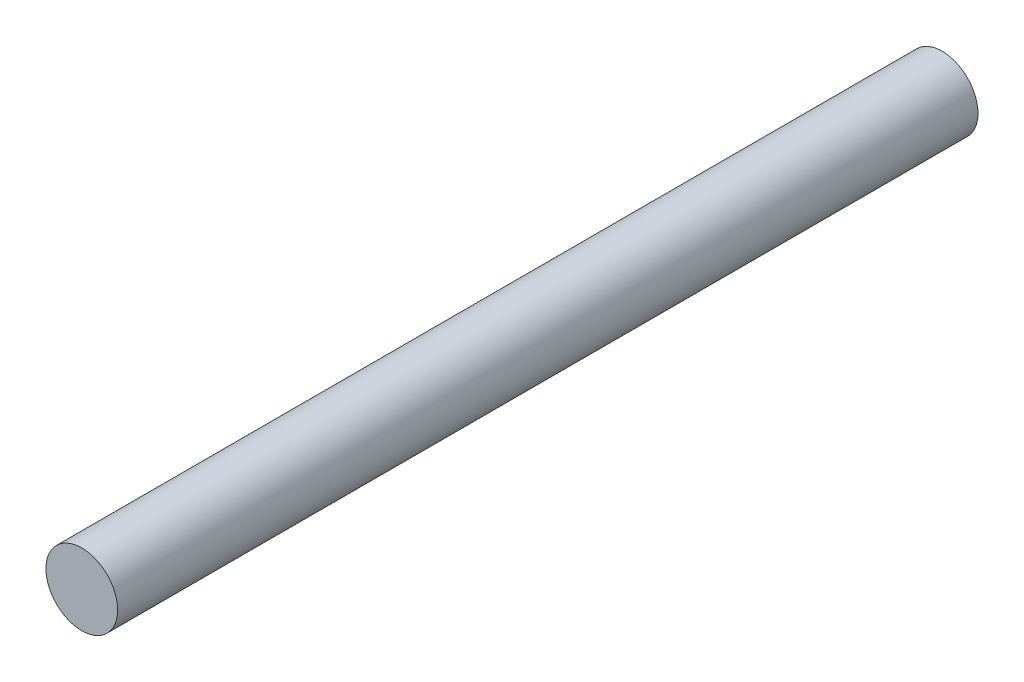
ISO-10303-21;
HEADER;
FILE_DESCRIPTION(('STEP AP214'),'2;1');
FILE_NAME('part.step','',(''),(''),'','','');
FILE_SCHEMA(('AUTOMOTIVE_DESIGN { 1 0 10303 214 1 1 1 1 }'));
ENDSEC;
DATA;
#1=APPLICATION_CONTEXT('core data for automotive mechanical design processes');
#2=APPLICATION_PROTOCOL_DEFINITION('international standard','automotive_design',2000,#1);
#3=PRODUCT_CONTEXT('',#1,'mechanical');
#4=PRODUCT('Part','Part','',(#3));
#5=PRODUCT_RELATED_PRODUCT_CATEGORY('part','',(#4));
#6=PRODUCT_DEFINITION_FORMATION('','',#4);
#7=PRODUCT_DEFINITION_CONTEXT('part definition',#1,'design');
#8=PRODUCT_DEFINITION('design','',#6,#7);
#9=PRODUCT_DEFINITION_SHAPE('','',#8);
#10=(LENGTH_UNIT() NAMED_UNIT(*) SI_UNIT(.MILLI.,.METRE.));
#11=(NAMED_UNIT(*) PLANE_ANGLE_UNIT() SI_UNIT($,.RADIAN.));
#12=(NAMED_UNIT(*) SI_UNIT($,.STERADIAN.) SOLID_ANGLE_UNIT());
#13=UNCERTAINTY_MEASURE_WITH_UNIT(LENGTH_MEASURE(1.E-05),#10,'distance_accuracy_value','');
#14=(GEOMETRIC_REPRESENTATION_CONTEXT(3) GLOBAL_UNCERTAINTY_ASSIGNED_CONTEXT((#13)) GLOBAL_UNIT_ASSIGNED_CONTEXT((#10,
#11,#12)) REPRESENTATION_CONTEXT('',''));
#15=CARTESIAN_POINT('',(0.,0.,0.));
#16=DIRECTION('',(0.,0.,1.));
#17=DIRECTION('',(1.,0.,0.));
#18=AXIS2_PLACEMENT_3D('',#15,#16,#17);
#19=CARTESIAN_POINT('',(0.,0.,72.));
#20=DIRECTION('',(0.,0.,-1.));
#21=DIRECTION('',(-1.,0.,0.));
#22=AXIS2_PLACEMENT_3D('',#19,#20,#21);
#23=CYLINDRICAL_SURFACE('',#22,3.);
#24=CARTESIAN_POINT('',(0.,0.,72.));
#25=DIRECTION('',(0.,0.,1.));
#26=DIRECTION('',(1.,0.,0.));
#27=AXIS2_PLACEMENT_3D('',#24,#25,#26);
#28=CIRCLE('',#27,3.);
#29=CARTESIAN_POINT('',(3.,0.,72.));
#30=VERTEX_POINT('',#29);
#31=EDGE_CURVE('E10',#30,#30,#28,.T.);
#32=ORIENTED_EDGE('',*,*,#31,.F.);
#33=EDGE_LOOP('',(#32));
#34=FACE_BOUND('',#33,.T.);
#35=CARTESIAN_POINT('',(0.,0.,0.));
#36=DIRECTION('',(0.,0.,1.));
#37=DIRECTION('',(1.,0.,0.));
#38=AXIS2_PLACEMENT_3D('',#35,#36,#37);
#39=CIRCLE('',#38,3.);
#40=CARTESIAN_POINT('',(3.,0.,0.));
#41=VERTEX_POINT('',#40);
#42=EDGE_CURVE('E40',#41,#41,#39,.T.);
#43=ORIENTED_EDGE('',*,*,#42,.T.);
#44=EDGE_LOOP('',(#43));
#45=FACE_BOUND('',#44,.T.);
#46=ADVANCED_FACE('F37',(#34,#45),#23,.T.);
#47=CARTESIAN_POINT('',(0.,0.,72.));
#48=DIRECTION('',(0.,0.,1.));
#49=DIRECTION('',(1.,0.,0.));
#50=AXIS2_PLACEMENT_3D('',#47,#48,#49);
#51=PLANE('',#50);
#52=ORIENTED_EDGE('',*,*,#31,.T.);
#53=EDGE_LOOP('',(#52));
#54=FACE_BOUND('',#53,.T.);
#55=ADVANCED_FACE('F52',(#54),#51,.T.);
#56=CARTESIAN_POINT('',(0.,0.,0.));
#57=DIRECTION('',(0.,0.,1.));
#58=DIRECTION('',(1.,0.,0.));
#59=AXIS2_PLACEMENT_3D('',#56,#57,#58);
#60=PLANE('',#59);
#61=ORIENTED_EDGE('',*,*,#42,.F.);
#62=EDGE_LOOP('',(#61));
#63=FACE_BOUND('',#62,.T.);
#64=ADVANCED_FACE('F50',(#63),#60,.F.);
#65=CLOSED_SHELL('',(#46,#55,#64));
#66=MANIFOLD_SOLID_BREP('B2',#65);
#67=ADVANCED_BREP_SHAPE_REPRESENTATION('',(#18,#66),#14);
#68=SHAPE_DEFINITION_REPRESENTATION(#9,#67);
ENDSEC;
END-ISO-10303-21;
